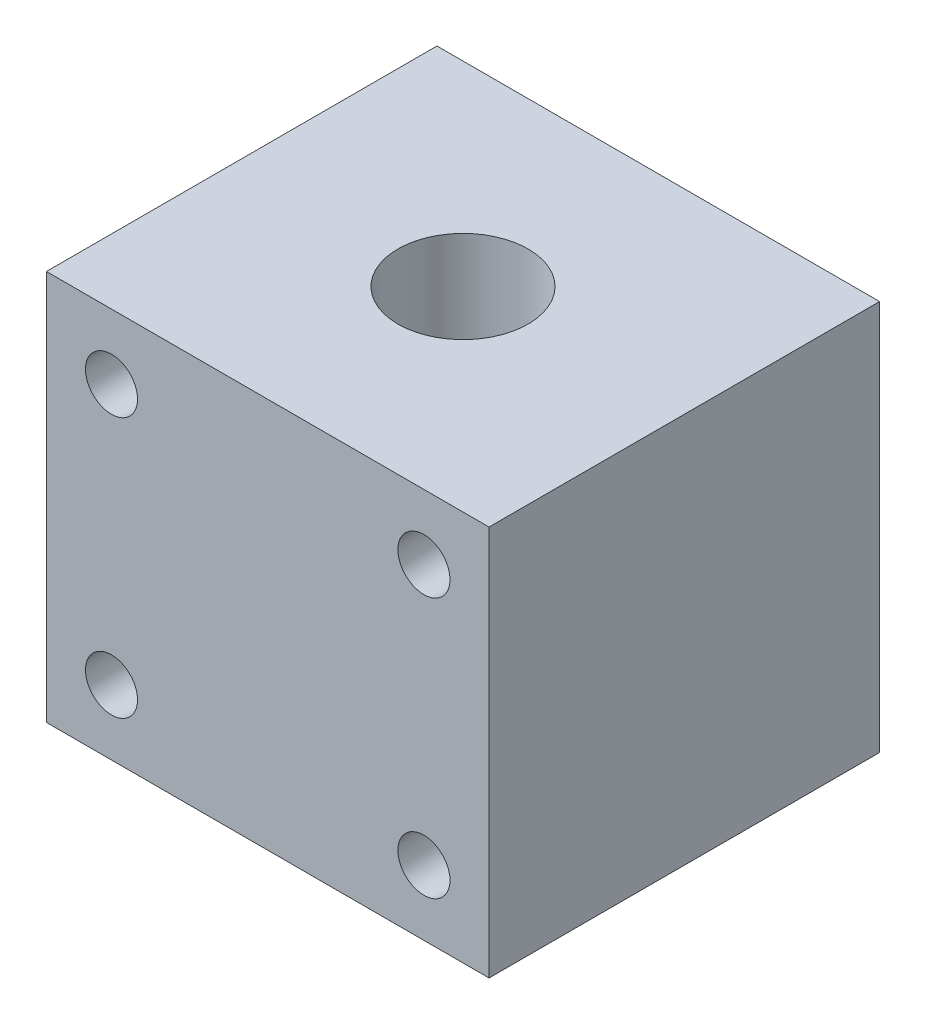
ISO-10303-21;
HEADER;
FILE_DESCRIPTION(('STEP AP214'),'2;1');
FILE_NAME('part.step','',(''),(''),'','','');
FILE_SCHEMA(('AUTOMOTIVE_DESIGN { 1 0 10303 214 1 1 1 1 }'));
ENDSEC;
DATA;
#1=APPLICATION_CONTEXT('core data for automotive mechanical design processes');
#2=APPLICATION_PROTOCOL_DEFINITION('international standard','automotive_design',2000,#1);
#3=PRODUCT_CONTEXT('',#1,'mechanical');
#4=PRODUCT('Part','Part','',(#3));
#5=PRODUCT_RELATED_PRODUCT_CATEGORY('part','',(#4));
#6=PRODUCT_DEFINITION_FORMATION('','',#4);
#7=PRODUCT_DEFINITION_CONTEXT('part definition',#1,'design');
#8=PRODUCT_DEFINITION('design','',#6,#7);
#9=PRODUCT_DEFINITION_SHAPE('','',#8);
#10=(LENGTH_UNIT() NAMED_UNIT(*) SI_UNIT(.MILLI.,.METRE.));
#11=(NAMED_UNIT(*) PLANE_ANGLE_UNIT() SI_UNIT($,.RADIAN.));
#12=(NAMED_UNIT(*) SI_UNIT($,.STERADIAN.) SOLID_ANGLE_UNIT());
#13=UNCERTAINTY_MEASURE_WITH_UNIT(LENGTH_MEASURE(1.E-05),#10,'distance_accuracy_value','');
#14=(GEOMETRIC_REPRESENTATION_CONTEXT(3) GLOBAL_UNCERTAINTY_ASSIGNED_CONTEXT((#13)) GLOBAL_UNIT_ASSIGNED_CONTEXT((#10,
#11,#12)) REPRESENTATION_CONTEXT('',''));
#15=CARTESIAN_POINT('',(0.,0.,0.));
#16=DIRECTION('',(0.,0.,1.));
#17=DIRECTION('',(1.,0.,0.));
#18=AXIS2_PLACEMENT_3D('',#15,#16,#17);
#19=CARTESIAN_POINT('',(0.,30.,0.));
#20=DIRECTION('',(0.,1.,0.));
#21=DIRECTION('',(0.,0.,1.));
#22=AXIS2_PLACEMENT_3D('',#19,#20,#21);
#23=PLANE('',#22);
#24=DIRECTION('',(0.,0.,1.));
#25=VECTOR('',#24,1.);
#26=CARTESIAN_POINT('',(0.,30.,0.));
#27=LINE('',#26,#25);
#28=CARTESIAN_POINT('',(0.,30.,0.));
#29=VERTEX_POINT('',#28);
#30=CARTESIAN_POINT('',(0.,30.,30.));
#31=VERTEX_POINT('',#30);
#32=EDGE_CURVE('E87',#29,#31,#27,.T.);
#33=ORIENTED_EDGE('',*,*,#32,.T.);
#34=DIRECTION('',(1.,0.,0.));
#35=VECTOR('',#34,1.);
#36=CARTESIAN_POINT('',(0.,30.,30.));
#37=LINE('',#36,#35);
#38=CARTESIAN_POINT('',(34.,30.,30.));
#39=VERTEX_POINT('',#38);
#40=EDGE_CURVE('E82',#31,#39,#37,.T.);
#41=ORIENTED_EDGE('',*,*,#40,.T.);
#42=DIRECTION('',(0.,0.,-1.));
#43=VECTOR('',#42,1.);
#44=CARTESIAN_POINT('',(34.,30.,0.));
#45=LINE('',#44,#43);
#46=CARTESIAN_POINT('',(34.,30.,0.));
#47=VERTEX_POINT('',#46);
#48=EDGE_CURVE('E85',#39,#47,#45,.T.);
#49=ORIENTED_EDGE('',*,*,#48,.T.);
#50=DIRECTION('',(-1.,0.,0.));
#51=VECTOR('',#50,1.);
#52=CARTESIAN_POINT('',(0.,30.,0.));
#53=LINE('',#52,#51);
#54=EDGE_CURVE('E52',#47,#29,#53,.T.);
#55=ORIENTED_EDGE('',*,*,#54,.T.);
#56=EDGE_LOOP('',(#33,#41,#49,#55));
#57=FACE_BOUND('',#56,.T.);
#58=CARTESIAN_POINT('',(17.,30.,15.));
#59=DIRECTION('',(0.,1.,0.));
#60=DIRECTION('',(0.,0.,1.));
#61=AXIS2_PLACEMENT_3D('',#58,#59,#60);
#62=CIRCLE('',#61,5.);
#63=CARTESIAN_POINT('',(17.,30.,20.));
#64=VERTEX_POINT('',#63);
#65=EDGE_CURVE('E103',#64,#64,#62,.T.);
#66=ORIENTED_EDGE('',*,*,#65,.F.);
#67=EDGE_LOOP('',(#66));
#68=FACE_BOUND('',#67,.T.);
#69=ADVANCED_FACE('F33',(#57,#68),#23,.T.);
#70=CARTESIAN_POINT('',(0.,0.,0.));
#71=DIRECTION('',(0.,1.,0.));
#72=DIRECTION('',(0.,0.,1.));
#73=AXIS2_PLACEMENT_3D('',#70,#71,#72);
#74=PLANE('',#73);
#75=DIRECTION('',(0.,0.,1.));
#76=VECTOR('',#75,1.);
#77=CARTESIAN_POINT('',(0.,0.,0.));
#78=LINE('',#77,#76);
#79=CARTESIAN_POINT('',(0.,0.,0.));
#80=VERTEX_POINT('',#79);
#81=CARTESIAN_POINT('',(0.,0.,30.));
#82=VERTEX_POINT('',#81);
#83=EDGE_CURVE('E100',#80,#82,#78,.T.);
#84=ORIENTED_EDGE('',*,*,#83,.F.);
#85=DIRECTION('',(-1.,0.,0.));
#86=VECTOR('',#85,1.);
#87=CARTESIAN_POINT('',(0.,0.,0.));
#88=LINE('',#87,#86);
#89=CARTESIAN_POINT('',(34.,0.,0.));
#90=VERTEX_POINT('',#89);
#91=EDGE_CURVE('E75',#90,#80,#88,.T.);
#92=ORIENTED_EDGE('',*,*,#91,.F.);
#93=DIRECTION('',(0.,0.,-1.));
#94=VECTOR('',#93,1.);
#95=CARTESIAN_POINT('',(34.,0.,0.));
#96=LINE('',#95,#94);
#97=CARTESIAN_POINT('',(34.,0.,30.));
#98=VERTEX_POINT('',#97);
#99=EDGE_CURVE('E69',#98,#90,#96,.T.);
#100=ORIENTED_EDGE('',*,*,#99,.F.);
#101=DIRECTION('',(1.,0.,0.));
#102=VECTOR('',#101,1.);
#103=CARTESIAN_POINT('',(0.,0.,30.));
#104=LINE('',#103,#102);
#105=EDGE_CURVE('E91',#82,#98,#104,.T.);
#106=ORIENTED_EDGE('',*,*,#105,.F.);
#107=EDGE_LOOP('',(#84,#92,#100,#106));
#108=FACE_BOUND('',#107,.T.);
#109=CARTESIAN_POINT('',(17.,0.,15.));
#110=DIRECTION('',(0.,1.,0.));
#111=DIRECTION('',(0.,0.,1.));
#112=AXIS2_PLACEMENT_3D('',#109,#110,#111);
#113=CIRCLE('',#112,5.);
#114=CARTESIAN_POINT('',(17.,0.,20.));
#115=VERTEX_POINT('',#114);
#116=EDGE_CURVE('E120',#115,#115,#113,.T.);
#117=ORIENTED_EDGE('',*,*,#116,.T.);
#118=EDGE_LOOP('',(#117));
#119=FACE_BOUND('',#118,.T.);
#120=ADVANCED_FACE('F170',(#108,#119),#74,.F.);
#121=CARTESIAN_POINT('',(0.,30.,0.));
#122=DIRECTION('',(1.,0.,0.));
#123=DIRECTION('',(0.,0.,-1.));
#124=AXIS2_PLACEMENT_3D('',#121,#122,#123);
#125=PLANE('',#124);
#126=ORIENTED_EDGE('',*,*,#83,.T.);
#127=DIRECTION('',(0.,-1.,0.));
#128=VECTOR('',#127,1.);
#129=CARTESIAN_POINT('',(0.,30.,30.));
#130=LINE('',#129,#128);
#131=EDGE_CURVE('E11',#31,#82,#130,.T.);
#132=ORIENTED_EDGE('',*,*,#131,.F.);
#133=ORIENTED_EDGE('',*,*,#32,.F.);
#134=DIRECTION('',(0.,-1.,0.));
#135=VECTOR('',#134,1.);
#136=CARTESIAN_POINT('',(0.,30.,0.));
#137=LINE('',#136,#135);
#138=EDGE_CURVE('E96',#29,#80,#137,.T.);
#139=ORIENTED_EDGE('',*,*,#138,.T.);
#140=EDGE_LOOP('',(#126,#132,#133,#139));
#141=FACE_BOUND('',#140,.T.);
#142=ADVANCED_FACE('F35',(#141),#125,.F.);
#143=CARTESIAN_POINT('',(0.,30.,30.));
#144=DIRECTION('',(0.,0.,-1.));
#145=DIRECTION('',(-1.,0.,0.));
#146=AXIS2_PLACEMENT_3D('',#143,#144,#145);
#147=PLANE('',#146);
#148=CARTESIAN_POINT('',(29.,5.,30.));
#149=DIRECTION('',(0.,0.,-1.));
#150=DIRECTION('',(1.,0.,0.));
#151=AXIS2_PLACEMENT_3D('',#148,#149,#150);
#152=CIRCLE('',#151,2.);
#153=CARTESIAN_POINT('',(31.,5.,30.));
#154=VERTEX_POINT('',#153);
#155=EDGE_CURVE('E133',#154,#154,#152,.T.);
#156=ORIENTED_EDGE('',*,*,#155,.T.);
#157=EDGE_LOOP('',(#156));
#158=FACE_BOUND('',#157,.T.);
#159=CARTESIAN_POINT('',(5.,5.,30.));
#160=DIRECTION('',(0.,0.,-1.));
#161=DIRECTION('',(-1.,0.,0.));
#162=AXIS2_PLACEMENT_3D('',#159,#160,#161);
#163=CIRCLE('',#162,2.);
#164=CARTESIAN_POINT('',(3.,5.,30.));
#165=VERTEX_POINT('',#164);
#166=EDGE_CURVE('E136',#165,#165,#163,.T.);
#167=ORIENTED_EDGE('',*,*,#166,.T.);
#168=EDGE_LOOP('',(#167));
#169=FACE_BOUND('',#168,.T.);
#170=CARTESIAN_POINT('',(5.,25.,30.));
#171=DIRECTION('',(0.,0.,-1.));
#172=DIRECTION('',(1.,0.,0.));
#173=AXIS2_PLACEMENT_3D('',#170,#171,#172);
#174=CIRCLE('',#173,2.);
#175=CARTESIAN_POINT('',(7.,25.,30.));
#176=VERTEX_POINT('',#175);
#177=EDGE_CURVE('E132',#176,#176,#174,.T.);
#178=ORIENTED_EDGE('',*,*,#177,.T.);
#179=EDGE_LOOP('',(#178));
#180=FACE_BOUND('',#179,.T.);
#181=CARTESIAN_POINT('',(29.,25.,30.));
#182=DIRECTION('',(0.,0.,-1.));
#183=DIRECTION('',(-1.,0.,0.));
#184=AXIS2_PLACEMENT_3D('',#181,#182,#183);
#185=CIRCLE('',#184,2.00000000000001);
#186=CARTESIAN_POINT('',(27.,25.,30.));
#187=VERTEX_POINT('',#186);
#188=EDGE_CURVE('E113',#187,#187,#185,.T.);
#189=ORIENTED_EDGE('',*,*,#188,.T.);
#190=EDGE_LOOP('',(#189));
#191=FACE_BOUND('',#190,.T.);
#192=ORIENTED_EDGE('',*,*,#105,.T.);
#193=DIRECTION('',(0.,-1.,0.));
#194=VECTOR('',#193,1.);
#195=CARTESIAN_POINT('',(34.,30.,30.));
#196=LINE('',#195,#194);
#197=EDGE_CURVE('E43',#39,#98,#196,.T.);
#198=ORIENTED_EDGE('',*,*,#197,.F.);
#199=ORIENTED_EDGE('',*,*,#40,.F.);
#200=ORIENTED_EDGE('',*,*,#131,.T.);
#201=EDGE_LOOP('',(#192,#198,#199,#200));
#202=FACE_BOUND('',#201,.T.);
#203=ADVANCED_FACE('F90',(#158,#169,#180,#191,#202),#147,.F.);
#204=CARTESIAN_POINT('',(34.,30.,0.));
#205=DIRECTION('',(-1.,0.,0.));
#206=DIRECTION('',(0.,0.,1.));
#207=AXIS2_PLACEMENT_3D('',#204,#205,#206);
#208=PLANE('',#207);
#209=ORIENTED_EDGE('',*,*,#99,.T.);
#210=DIRECTION('',(0.,-1.,0.));
#211=VECTOR('',#210,1.);
#212=CARTESIAN_POINT('',(34.,30.,0.));
#213=LINE('',#212,#211);
#214=EDGE_CURVE('E92',#47,#90,#213,.T.);
#215=ORIENTED_EDGE('',*,*,#214,.F.);
#216=ORIENTED_EDGE('',*,*,#48,.F.);
#217=ORIENTED_EDGE('',*,*,#197,.T.);
#218=EDGE_LOOP('',(#209,#215,#216,#217));
#219=FACE_BOUND('',#218,.T.);
#220=ADVANCED_FACE('F94',(#219),#208,.F.);
#221=CARTESIAN_POINT('',(0.,30.,0.));
#222=DIRECTION('',(0.,0.,1.));
#223=DIRECTION('',(1.,0.,0.));
#224=AXIS2_PLACEMENT_3D('',#221,#222,#223);
#225=PLANE('',#224);
#226=CARTESIAN_POINT('',(29.,5.,0.));
#227=DIRECTION('',(0.,0.,1.));
#228=DIRECTION('',(1.,0.,0.));
#229=AXIS2_PLACEMENT_3D('',#226,#227,#228);
#230=CIRCLE('',#229,2.);
#231=CARTESIAN_POINT('',(31.,5.,0.));
#232=VERTEX_POINT('',#231);
#233=EDGE_CURVE('E37',#232,#232,#230,.T.);
#234=ORIENTED_EDGE('',*,*,#233,.T.);
#235=EDGE_LOOP('',(#234));
#236=FACE_BOUND('',#235,.T.);
#237=CARTESIAN_POINT('',(5.,5.,0.));
#238=DIRECTION('',(0.,0.,1.));
#239=DIRECTION('',(1.,0.,0.));
#240=AXIS2_PLACEMENT_3D('',#237,#238,#239);
#241=CIRCLE('',#240,2.);
#242=CARTESIAN_POINT('',(7.,5.,0.));
#243=VERTEX_POINT('',#242);
#244=EDGE_CURVE('E115',#243,#243,#241,.T.);
#245=ORIENTED_EDGE('',*,*,#244,.T.);
#246=EDGE_LOOP('',(#245));
#247=FACE_BOUND('',#246,.T.);
#248=CARTESIAN_POINT('',(5.,25.,0.));
#249=DIRECTION('',(0.,0.,1.));
#250=DIRECTION('',(1.,0.,0.));
#251=AXIS2_PLACEMENT_3D('',#248,#249,#250);
#252=CIRCLE('',#251,2.);
#253=CARTESIAN_POINT('',(7.,25.,0.));
#254=VERTEX_POINT('',#253);
#255=EDGE_CURVE('E112',#254,#254,#252,.T.);
#256=ORIENTED_EDGE('',*,*,#255,.T.);
#257=EDGE_LOOP('',(#256));
#258=FACE_BOUND('',#257,.T.);
#259=CARTESIAN_POINT('',(29.,25.,0.));
#260=DIRECTION('',(0.,0.,1.));
#261=DIRECTION('',(1.,0.,0.));
#262=AXIS2_PLACEMENT_3D('',#259,#260,#261);
#263=CIRCLE('',#262,2.00000000000001);
#264=CARTESIAN_POINT('',(31.,25.,0.));
#265=VERTEX_POINT('',#264);
#266=EDGE_CURVE('E109',#265,#265,#263,.T.);
#267=ORIENTED_EDGE('',*,*,#266,.T.);
#268=EDGE_LOOP('',(#267));
#269=FACE_BOUND('',#268,.T.);
#270=ORIENTED_EDGE('',*,*,#91,.T.);
#271=ORIENTED_EDGE('',*,*,#138,.F.);
#272=ORIENTED_EDGE('',*,*,#54,.F.);
#273=ORIENTED_EDGE('',*,*,#214,.T.);
#274=EDGE_LOOP('',(#270,#271,#272,#273));
#275=FACE_BOUND('',#274,.T.);
#276=ADVANCED_FACE('F152',(#236,#247,#258,#269,#275),#225,.F.);
#277=CARTESIAN_POINT('',(17.,30.,15.));
#278=DIRECTION('',(0.,-1.,0.));
#279=DIRECTION('',(0.,0.,-1.));
#280=AXIS2_PLACEMENT_3D('',#277,#278,#279);
#281=CYLINDRICAL_SURFACE('',#280,5.);
#282=ORIENTED_EDGE('',*,*,#65,.T.);
#283=EDGE_LOOP('',(#282));
#284=FACE_BOUND('',#283,.T.);
#285=ORIENTED_EDGE('',*,*,#116,.F.);
#286=EDGE_LOOP('',(#285));
#287=FACE_BOUND('',#286,.T.);
#288=ADVANCED_FACE('F155',(#284,#287),#281,.F.);
#289=CARTESIAN_POINT('',(29.,25.,30.));
#290=DIRECTION('',(0.,0.,-1.));
#291=DIRECTION('',(-1.,0.,0.));
#292=AXIS2_PLACEMENT_3D('',#289,#290,#291);
#293=CYLINDRICAL_SURFACE('',#292,2.00000000000001);
#294=ORIENTED_EDGE('',*,*,#188,.F.);
#295=EDGE_LOOP('',(#294));
#296=FACE_BOUND('',#295,.T.);
#297=ORIENTED_EDGE('',*,*,#266,.F.);
#298=EDGE_LOOP('',(#297));
#299=FACE_BOUND('',#298,.T.);
#300=ADVANCED_FACE('F148',(#296,#299),#293,.F.);
#301=CARTESIAN_POINT('',(5.,25.,30.));
#302=DIRECTION('',(0.,0.,-1.));
#303=DIRECTION('',(-1.,0.,0.));
#304=AXIS2_PLACEMENT_3D('',#301,#302,#303);
#305=CYLINDRICAL_SURFACE('',#304,2.);
#306=ORIENTED_EDGE('',*,*,#177,.F.);
#307=EDGE_LOOP('',(#306));
#308=FACE_BOUND('',#307,.T.);
#309=ORIENTED_EDGE('',*,*,#255,.F.);
#310=EDGE_LOOP('',(#309));
#311=FACE_BOUND('',#310,.T.);
#312=ADVANCED_FACE('F144',(#308,#311),#305,.F.);
#313=CARTESIAN_POINT('',(5.,5.,30.));
#314=DIRECTION('',(0.,0.,-1.));
#315=DIRECTION('',(-1.,0.,0.));
#316=AXIS2_PLACEMENT_3D('',#313,#314,#315);
#317=CYLINDRICAL_SURFACE('',#316,2.);
#318=ORIENTED_EDGE('',*,*,#166,.F.);
#319=EDGE_LOOP('',(#318));
#320=FACE_BOUND('',#319,.T.);
#321=ORIENTED_EDGE('',*,*,#244,.F.);
#322=EDGE_LOOP('',(#321));
#323=FACE_BOUND('',#322,.T.);
#324=ADVANCED_FACE('F147',(#320,#323),#317,.F.);
#325=CARTESIAN_POINT('',(29.,5.,30.));
#326=DIRECTION('',(0.,0.,-1.));
#327=DIRECTION('',(-1.,0.,0.));
#328=AXIS2_PLACEMENT_3D('',#325,#326,#327);
#329=CYLINDRICAL_SURFACE('',#328,2.);
#330=ORIENTED_EDGE('',*,*,#155,.F.);
#331=EDGE_LOOP('',(#330));
#332=FACE_BOUND('',#331,.T.);
#333=ORIENTED_EDGE('',*,*,#233,.F.);
#334=EDGE_LOOP('',(#333));
#335=FACE_BOUND('',#334,.T.);
#336=ADVANCED_FACE('F191',(#332,#335),#329,.F.);
#337=CLOSED_SHELL('',(#69,#120,#142,#203,#220,#276,#288,#300,#312,#324,#336));
#338=MANIFOLD_SOLID_BREP('B2',#337);
#339=ADVANCED_BREP_SHAPE_REPRESENTATION('',(#18,#338),#14);
#340=SHAPE_DEFINITION_REPRESENTATION(#9,#339);
ENDSEC;
END-ISO-10303-21;
